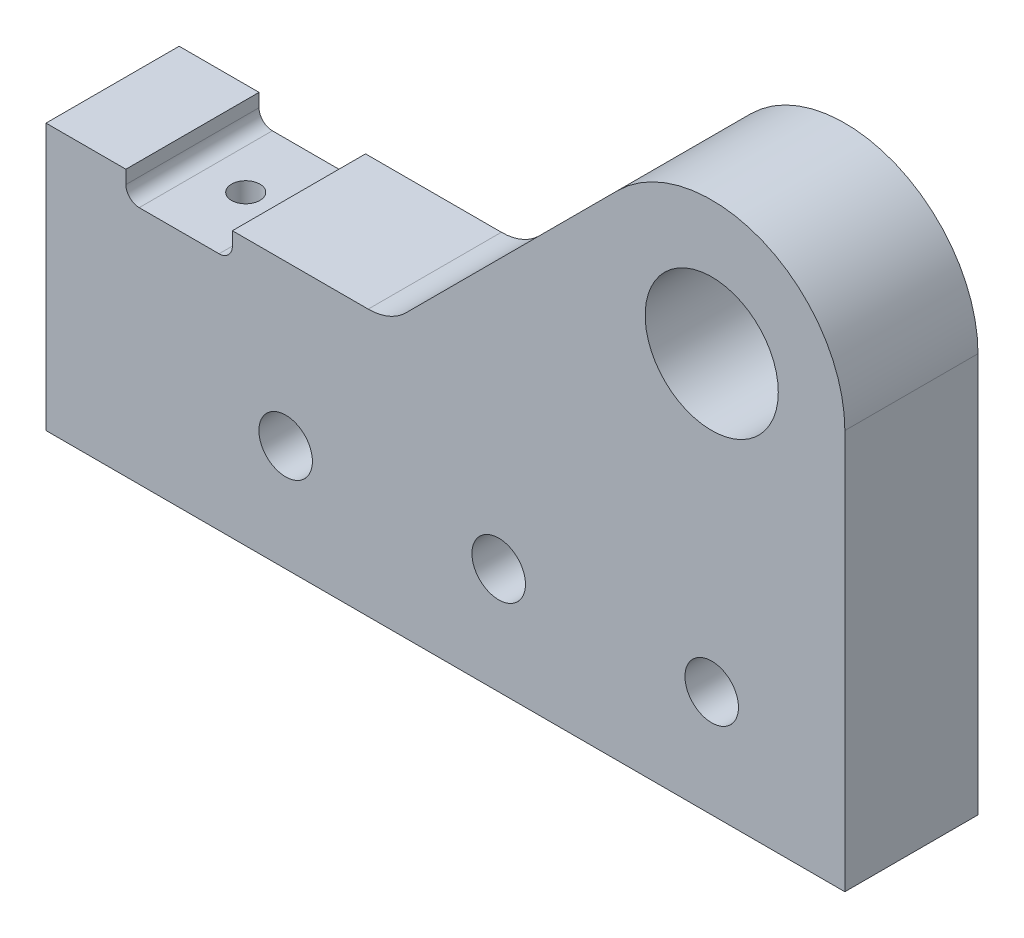
ISO-10303-21;
HEADER;
FILE_DESCRIPTION(('STEP AP214'),'2;1');
FILE_NAME('part.step','',(''),(''),'','','');
FILE_SCHEMA(('AUTOMOTIVE_DESIGN { 1 0 10303 214 1 1 1 1 }'));
ENDSEC;
DATA;
#1=APPLICATION_CONTEXT('core data for automotive mechanical design processes');
#2=APPLICATION_PROTOCOL_DEFINITION('international standard','automotive_design',2000,#1);
#3=PRODUCT_CONTEXT('',#1,'mechanical');
#4=PRODUCT('Part','Part','',(#3));
#5=PRODUCT_RELATED_PRODUCT_CATEGORY('part','',(#4));
#6=PRODUCT_DEFINITION_FORMATION('','',#4);
#7=PRODUCT_DEFINITION_CONTEXT('part definition',#1,'design');
#8=PRODUCT_DEFINITION('design','',#6,#7);
#9=PRODUCT_DEFINITION_SHAPE('','',#8);
#10=(LENGTH_UNIT() NAMED_UNIT(*) SI_UNIT(.MILLI.,.METRE.));
#11=(NAMED_UNIT(*) PLANE_ANGLE_UNIT() SI_UNIT($,.RADIAN.));
#12=(NAMED_UNIT(*) SI_UNIT($,.STERADIAN.) SOLID_ANGLE_UNIT());
#13=UNCERTAINTY_MEASURE_WITH_UNIT(LENGTH_MEASURE(1.E-05),#10,'distance_accuracy_value','');
#14=(GEOMETRIC_REPRESENTATION_CONTEXT(3) GLOBAL_UNCERTAINTY_ASSIGNED_CONTEXT((#13)) GLOBAL_UNIT_ASSIGNED_CONTEXT((#10,
#11,#12)) REPRESENTATION_CONTEXT('',''));
#15=CARTESIAN_POINT('',(0.,0.,0.));
#16=DIRECTION('',(0.,0.,1.));
#17=DIRECTION('',(1.,0.,0.));
#18=AXIS2_PLACEMENT_3D('',#15,#16,#17);
#19=CARTESIAN_POINT('',(25.4,25.4,0.));
#20=DIRECTION('',(0.,0.,-1.));
#21=DIRECTION('',(-1.,0.,0.));
#22=AXIS2_PLACEMENT_3D('',#19,#20,#21);
#23=PLANE('',#22);
#24=CARTESIAN_POINT('',(25.4,25.4,0.));
#25=DIRECTION('',(0.,0.,1.));
#26=DIRECTION('',(1.,0.,0.));
#27=AXIS2_PLACEMENT_3D('',#24,#25,#26);
#28=CIRCLE('',#27,6.35000000000002);
#29=CARTESIAN_POINT('',(31.75,25.4,0.));
#30=VERTEX_POINT('',#29);
#31=EDGE_CURVE('E363',#30,#30,#28,.T.);
#32=ORIENTED_EDGE('',*,*,#31,.T.);
#33=EDGE_LOOP('',(#32));
#34=FACE_BOUND('',#33,.T.);
#35=DIRECTION('',(0.,1.,0.));
#36=VECTOR('',#35,1.);
#37=CARTESIAN_POINT('',(38.1,12.7,0.));
#38=LINE('',#37,#36);
#39=CARTESIAN_POINT('',(38.1,-12.7,0.));
#40=VERTEX_POINT('',#39);
#41=CARTESIAN_POINT('',(38.1,25.4,0.));
#42=VERTEX_POINT('',#41);
#43=EDGE_CURVE('E121',#40,#42,#38,.T.);
#44=ORIENTED_EDGE('',*,*,#43,.F.);
#45=DIRECTION('',(1.,0.,0.));
#46=VECTOR('',#45,1.);
#47=CARTESIAN_POINT('',(-38.1,-12.7,0.));
#48=LINE('',#47,#46);
#49=CARTESIAN_POINT('',(-38.1,-12.7,0.));
#50=VERTEX_POINT('',#49);
#51=EDGE_CURVE('E222',#50,#40,#48,.T.);
#52=ORIENTED_EDGE('',*,*,#51,.F.);
#53=DIRECTION('',(0.,-1.,0.));
#54=VECTOR('',#53,1.);
#55=CARTESIAN_POINT('',(-38.1,-12.7,0.));
#56=LINE('',#55,#54);
#57=CARTESIAN_POINT('',(-38.1,12.7,0.));
#58=VERTEX_POINT('',#57);
#59=EDGE_CURVE('E114',#58,#50,#56,.T.);
#60=ORIENTED_EDGE('',*,*,#59,.F.);
#61=DIRECTION('',(-1.,0.,0.));
#62=VECTOR('',#61,1.);
#63=CARTESIAN_POINT('',(-38.1,12.7,0.));
#64=LINE('',#63,#62);
#65=CARTESIAN_POINT('',(-30.48,12.7,0.));
#66=VERTEX_POINT('',#65);
#67=EDGE_CURVE('E173',#66,#58,#64,.T.);
#68=ORIENTED_EDGE('',*,*,#67,.F.);
#69=DIRECTION('',(0.,1.,0.));
#70=VECTOR('',#69,1.);
#71=CARTESIAN_POINT('',(-30.48,12.7,0.));
#72=LINE('',#71,#70);
#73=CARTESIAN_POINT('',(-30.48,11.43,0.));
#74=VERTEX_POINT('',#73);
#75=EDGE_CURVE('E215',#74,#66,#72,.T.);
#76=ORIENTED_EDGE('',*,*,#75,.F.);
#77=CARTESIAN_POINT('',(-29.21,11.43,0.));
#78=DIRECTION('',(0.,0.,-1.));
#79=DIRECTION('',(-1.,0.,0.));
#80=AXIS2_PLACEMENT_3D('',#77,#78,#79);
#81=CIRCLE('',#80,1.27);
#82=CARTESIAN_POINT('',(-29.21,10.16,0.));
#83=VERTEX_POINT('',#82);
#84=EDGE_CURVE('E212',#83,#74,#81,.T.);
#85=ORIENTED_EDGE('',*,*,#84,.F.);
#86=DIRECTION('',(-1.,0.,0.));
#87=VECTOR('',#86,1.);
#88=CARTESIAN_POINT('',(-29.21,10.16,0.));
#89=LINE('',#88,#87);
#90=CARTESIAN_POINT('',(-21.59,10.16,0.));
#91=VERTEX_POINT('',#90);
#92=EDGE_CURVE('E209',#91,#83,#89,.T.);
#93=ORIENTED_EDGE('',*,*,#92,.F.);
#94=CARTESIAN_POINT('',(-21.59,11.43,0.));
#95=DIRECTION('',(0.,0.,-1.));
#96=DIRECTION('',(1.,0.,0.));
#97=AXIS2_PLACEMENT_3D('',#94,#95,#96);
#98=CIRCLE('',#97,1.27);
#99=CARTESIAN_POINT('',(-20.32,11.43,0.));
#100=VERTEX_POINT('',#99);
#101=EDGE_CURVE('E206',#100,#91,#98,.T.);
#102=ORIENTED_EDGE('',*,*,#101,.F.);
#103=DIRECTION('',(0.,-1.,0.));
#104=VECTOR('',#103,1.);
#105=CARTESIAN_POINT('',(-20.32,11.43,0.));
#106=LINE('',#105,#104);
#107=CARTESIAN_POINT('',(-20.32,12.7,0.));
#108=VERTEX_POINT('',#107);
#109=EDGE_CURVE('E203',#108,#100,#106,.T.);
#110=ORIENTED_EDGE('',*,*,#109,.F.);
#111=DIRECTION('',(-1.,0.,0.));
#112=VECTOR('',#111,1.);
#113=CARTESIAN_POINT('',(-20.32,12.7,0.));
#114=LINE('',#113,#112);
#115=CARTESIAN_POINT('',(-7.36471713899351,12.7,0.));
#116=VERTEX_POINT('',#115);
#117=EDGE_CURVE('E200',#116,#108,#114,.T.);
#118=ORIENTED_EDGE('',*,*,#117,.F.);
#119=CARTESIAN_POINT('',(-7.36471713899355,17.78,0.));
#120=DIRECTION('',(0.,0.,-1.));
#121=DIRECTION('',(-1.,0.,0.));
#122=AXIS2_PLACEMENT_3D('',#119,#120,#121);
#123=CIRCLE('',#122,5.08000000000001);
#124=CARTESIAN_POINT('',(-3.77261469056584,14.1878975515723,0.));
#125=VERTEX_POINT('',#124);
#126=EDGE_CURVE('E197',#125,#116,#123,.T.);
#127=ORIENTED_EDGE('',*,*,#126,.F.);
#128=DIRECTION('',(-0.707106781186545,-0.70710678118655,0.));
#129=VECTOR('',#128,1.);
#130=CARTESIAN_POINT('',(-3.77261469056584,14.1878975515723,0.));
#131=LINE('',#130,#129);
#132=CARTESIAN_POINT('',(16.4197438789308,34.3802561210691,0.));
#133=VERTEX_POINT('',#132);
#134=EDGE_CURVE('E194',#133,#125,#131,.T.);
#135=ORIENTED_EDGE('',*,*,#134,.F.);
#136=CARTESIAN_POINT('',(25.4,25.4,0.));
#137=DIRECTION('',(0.,0.,1.));
#138=DIRECTION('',(-1.,0.,0.));
#139=AXIS2_PLACEMENT_3D('',#136,#137,#138);
#140=CIRCLE('',#139,12.7);
#141=EDGE_CURVE('E190',#42,#133,#140,.T.);
#142=ORIENTED_EDGE('',*,*,#141,.F.);
#143=EDGE_LOOP('',(#44,#52,#60,#68,#76,#85,#93,#102,#110,#118,#127,#135,#142));
#144=FACE_BOUND('',#143,.T.);
#145=CARTESIAN_POINT('',(25.4,-2.54,0.));
#146=DIRECTION('',(0.,0.,1.));
#147=DIRECTION('',(1.,0.,0.));
#148=AXIS2_PLACEMENT_3D('',#145,#146,#147);
#149=CIRCLE('',#148,2.5527);
#150=CARTESIAN_POINT('',(27.9527,-2.54,0.));
#151=VERTEX_POINT('',#150);
#152=EDGE_CURVE('E369',#151,#151,#149,.T.);
#153=ORIENTED_EDGE('',*,*,#152,.T.);
#154=EDGE_LOOP('',(#153));
#155=FACE_BOUND('',#154,.T.);
#156=CARTESIAN_POINT('',(5.07999999999999,-2.54,0.));
#157=DIRECTION('',(0.,0.,1.));
#158=DIRECTION('',(1.,0.,0.));
#159=AXIS2_PLACEMENT_3D('',#156,#157,#158);
#160=CIRCLE('',#159,2.5527);
#161=CARTESIAN_POINT('',(7.63269999999999,-2.54,0.));
#162=VERTEX_POINT('',#161);
#163=EDGE_CURVE('E381',#162,#162,#160,.T.);
#164=ORIENTED_EDGE('',*,*,#163,.T.);
#165=EDGE_LOOP('',(#164));
#166=FACE_BOUND('',#165,.T.);
#167=CARTESIAN_POINT('',(-15.24,-2.54,0.));
#168=DIRECTION('',(0.,0.,1.));
#169=DIRECTION('',(1.,0.,0.));
#170=AXIS2_PLACEMENT_3D('',#167,#168,#169);
#171=CIRCLE('',#170,2.5527);
#172=CARTESIAN_POINT('',(-12.6873,-2.54,0.));
#173=VERTEX_POINT('',#172);
#174=EDGE_CURVE('E393',#173,#173,#171,.T.);
#175=ORIENTED_EDGE('',*,*,#174,.T.);
#176=EDGE_LOOP('',(#175));
#177=FACE_BOUND('',#176,.T.);
#178=ADVANCED_FACE('F51',(#34,#144,#155,#166,#177),#23,.T.);
#179=CARTESIAN_POINT('',(25.4,25.4,12.7));
#180=DIRECTION('',(0.,0.,-1.));
#181=DIRECTION('',(-1.,0.,0.));
#182=AXIS2_PLACEMENT_3D('',#179,#180,#181);
#183=PLANE('',#182);
#184=CARTESIAN_POINT('',(-15.24,-2.54,12.7));
#185=DIRECTION('',(0.,0.,1.));
#186=DIRECTION('',(1.,0.,0.));
#187=AXIS2_PLACEMENT_3D('',#184,#185,#186);
#188=CIRCLE('',#187,2.5527);
#189=CARTESIAN_POINT('',(-12.6873,-2.54,12.7));
#190=VERTEX_POINT('',#189);
#191=EDGE_CURVE('E399',#190,#190,#188,.T.);
#192=ORIENTED_EDGE('',*,*,#191,.F.);
#193=EDGE_LOOP('',(#192));
#194=FACE_BOUND('',#193,.T.);
#195=CARTESIAN_POINT('',(5.07999999999999,-2.54,12.7));
#196=DIRECTION('',(0.,0.,1.));
#197=DIRECTION('',(1.,0.,0.));
#198=AXIS2_PLACEMENT_3D('',#195,#196,#197);
#199=CIRCLE('',#198,2.5527);
#200=CARTESIAN_POINT('',(7.63269999999999,-2.54,12.7));
#201=VERTEX_POINT('',#200);
#202=EDGE_CURVE('E387',#201,#201,#199,.T.);
#203=ORIENTED_EDGE('',*,*,#202,.F.);
#204=EDGE_LOOP('',(#203));
#205=FACE_BOUND('',#204,.T.);
#206=CARTESIAN_POINT('',(25.4,-2.54,12.7));
#207=DIRECTION('',(0.,0.,1.));
#208=DIRECTION('',(1.,0.,0.));
#209=AXIS2_PLACEMENT_3D('',#206,#207,#208);
#210=CIRCLE('',#209,2.5527);
#211=CARTESIAN_POINT('',(27.9527,-2.54,12.7));
#212=VERTEX_POINT('',#211);
#213=EDGE_CURVE('E375',#212,#212,#210,.T.);
#214=ORIENTED_EDGE('',*,*,#213,.F.);
#215=EDGE_LOOP('',(#214));
#216=FACE_BOUND('',#215,.T.);
#217=DIRECTION('',(0.,1.,0.));
#218=VECTOR('',#217,1.);
#219=CARTESIAN_POINT('',(38.1,-12.7,12.7));
#220=LINE('',#219,#218);
#221=CARTESIAN_POINT('',(38.1,-12.7,12.7));
#222=VERTEX_POINT('',#221);
#223=CARTESIAN_POINT('',(38.1,25.4,12.7));
#224=VERTEX_POINT('',#223);
#225=EDGE_CURVE('E127',#222,#224,#220,.T.);
#226=ORIENTED_EDGE('',*,*,#225,.T.);
#227=CARTESIAN_POINT('',(25.4,25.4,12.7));
#228=DIRECTION('',(0.,0.,1.));
#229=DIRECTION('',(-1.,0.,0.));
#230=AXIS2_PLACEMENT_3D('',#227,#228,#229);
#231=CIRCLE('',#230,12.7);
#232=CARTESIAN_POINT('',(16.4197438789308,34.3802561210691,12.7));
#233=VERTEX_POINT('',#232);
#234=EDGE_CURVE('E324',#224,#233,#231,.T.);
#235=ORIENTED_EDGE('',*,*,#234,.T.);
#236=DIRECTION('',(-0.707106781186545,-0.70710678118655,0.));
#237=VECTOR('',#236,1.);
#238=CARTESIAN_POINT('',(-3.77261469056584,14.1878975515723,12.7));
#239=LINE('',#238,#237);
#240=CARTESIAN_POINT('',(-3.77261469056584,14.1878975515723,12.7));
#241=VERTEX_POINT('',#240);
#242=EDGE_CURVE('E269',#233,#241,#239,.T.);
#243=ORIENTED_EDGE('',*,*,#242,.T.);
#244=CARTESIAN_POINT('',(-7.36471713899355,17.78,12.7));
#245=DIRECTION('',(0.,0.,-1.));
#246=DIRECTION('',(-1.,0.,0.));
#247=AXIS2_PLACEMENT_3D('',#244,#245,#246);
#248=CIRCLE('',#247,5.08000000000001);
#249=CARTESIAN_POINT('',(-7.36471713899351,12.7,12.7));
#250=VERTEX_POINT('',#249);
#251=EDGE_CURVE('E288',#241,#250,#248,.T.);
#252=ORIENTED_EDGE('',*,*,#251,.T.);
#253=DIRECTION('',(-1.,0.,0.));
#254=VECTOR('',#253,1.);
#255=CARTESIAN_POINT('',(-20.32,12.7,12.7));
#256=LINE('',#255,#254);
#257=CARTESIAN_POINT('',(-20.32,12.7,12.7));
#258=VERTEX_POINT('',#257);
#259=EDGE_CURVE('E284',#250,#258,#256,.T.);
#260=ORIENTED_EDGE('',*,*,#259,.T.);
#261=DIRECTION('',(0.,-1.,0.));
#262=VECTOR('',#261,1.);
#263=CARTESIAN_POINT('',(-20.32,11.43,12.7));
#264=LINE('',#263,#262);
#265=CARTESIAN_POINT('',(-20.32,11.43,12.7));
#266=VERTEX_POINT('',#265);
#267=EDGE_CURVE('E287',#258,#266,#264,.T.);
#268=ORIENTED_EDGE('',*,*,#267,.T.);
#269=CARTESIAN_POINT('',(-21.59,11.43,12.7));
#270=DIRECTION('',(0.,0.,-1.));
#271=DIRECTION('',(1.,0.,0.));
#272=AXIS2_PLACEMENT_3D('',#269,#270,#271);
#273=CIRCLE('',#272,1.27);
#274=CARTESIAN_POINT('',(-21.59,10.16,12.7));
#275=VERTEX_POINT('',#274);
#276=EDGE_CURVE('E294',#266,#275,#273,.T.);
#277=ORIENTED_EDGE('',*,*,#276,.T.);
#278=DIRECTION('',(-1.,0.,0.));
#279=VECTOR('',#278,1.);
#280=CARTESIAN_POINT('',(-29.21,10.16,12.7));
#281=LINE('',#280,#279);
#282=CARTESIAN_POINT('',(-29.21,10.16,12.7));
#283=VERTEX_POINT('',#282);
#284=EDGE_CURVE('E301',#275,#283,#281,.T.);
#285=ORIENTED_EDGE('',*,*,#284,.T.);
#286=CARTESIAN_POINT('',(-29.21,11.43,12.7));
#287=DIRECTION('',(0.,0.,-1.));
#288=DIRECTION('',(-1.,0.,0.));
#289=AXIS2_PLACEMENT_3D('',#286,#287,#288);
#290=CIRCLE('',#289,1.27);
#291=CARTESIAN_POINT('',(-30.48,11.43,12.7));
#292=VERTEX_POINT('',#291);
#293=EDGE_CURVE('E304',#283,#292,#290,.T.);
#294=ORIENTED_EDGE('',*,*,#293,.T.);
#295=DIRECTION('',(0.,1.,0.));
#296=VECTOR('',#295,1.);
#297=CARTESIAN_POINT('',(-30.48,12.7,12.7));
#298=LINE('',#297,#296);
#299=CARTESIAN_POINT('',(-30.48,12.7,12.7));
#300=VERTEX_POINT('',#299);
#301=EDGE_CURVE('E164',#292,#300,#298,.T.);
#302=ORIENTED_EDGE('',*,*,#301,.T.);
#303=DIRECTION('',(-1.,0.,0.));
#304=VECTOR('',#303,1.);
#305=CARTESIAN_POINT('',(-38.1,12.7,12.7));
#306=LINE('',#305,#304);
#307=CARTESIAN_POINT('',(-38.1,12.7,12.7));
#308=VERTEX_POINT('',#307);
#309=EDGE_CURVE('E157',#300,#308,#306,.T.);
#310=ORIENTED_EDGE('',*,*,#309,.T.);
#311=DIRECTION('',(0.,-1.,0.));
#312=VECTOR('',#311,1.);
#313=CARTESIAN_POINT('',(-38.1,-12.7,12.7));
#314=LINE('',#313,#312);
#315=CARTESIAN_POINT('',(-38.1,-12.7,12.7));
#316=VERTEX_POINT('',#315);
#317=EDGE_CURVE('E162',#308,#316,#314,.T.);
#318=ORIENTED_EDGE('',*,*,#317,.T.);
#319=DIRECTION('',(1.,0.,0.));
#320=VECTOR('',#319,1.);
#321=CARTESIAN_POINT('',(-38.1,-12.7,12.7));
#322=LINE('',#321,#320);
#323=EDGE_CURVE('E69',#316,#222,#322,.T.);
#324=ORIENTED_EDGE('',*,*,#323,.T.);
#325=EDGE_LOOP('',(#226,#235,#243,#252,#260,#268,#277,#285,#294,#302,#310,#318,#324));
#326=FACE_BOUND('',#325,.T.);
#327=CARTESIAN_POINT('',(25.4,25.4,12.7));
#328=DIRECTION('',(0.,0.,1.));
#329=DIRECTION('',(1.,0.,0.));
#330=AXIS2_PLACEMENT_3D('',#327,#328,#329);
#331=CIRCLE('',#330,6.35000000000002);
#332=CARTESIAN_POINT('',(31.75,25.4,12.7));
#333=VERTEX_POINT('',#332);
#334=EDGE_CURVE('E191',#333,#333,#331,.T.);
#335=ORIENTED_EDGE('',*,*,#334,.F.);
#336=EDGE_LOOP('',(#335));
#337=FACE_BOUND('',#336,.T.);
#338=ADVANCED_FACE('F159',(#194,#205,#216,#326,#337),#183,.F.);
#339=CARTESIAN_POINT('',(38.1,12.7,12.7));
#340=DIRECTION('',(-1.,0.,0.));
#341=DIRECTION('',(0.,0.,1.));
#342=AXIS2_PLACEMENT_3D('',#339,#340,#341);
#343=PLANE('',#342);
#344=ORIENTED_EDGE('',*,*,#43,.T.);
#345=DIRECTION('',(0.,0.,-1.));
#346=VECTOR('',#345,1.);
#347=CARTESIAN_POINT('',(38.1,25.4,12.7));
#348=LINE('',#347,#346);
#349=EDGE_CURVE('E11',#224,#42,#348,.T.);
#350=ORIENTED_EDGE('',*,*,#349,.F.);
#351=ORIENTED_EDGE('',*,*,#225,.F.);
#352=DIRECTION('',(0.,0.,-1.));
#353=VECTOR('',#352,1.);
#354=CARTESIAN_POINT('',(38.1,-12.7,12.7));
#355=LINE('',#354,#353);
#356=EDGE_CURVE('E184',#222,#40,#355,.T.);
#357=ORIENTED_EDGE('',*,*,#356,.T.);
#358=EDGE_LOOP('',(#344,#350,#351,#357));
#359=FACE_BOUND('',#358,.T.);
#360=ADVANCED_FACE('F53',(#359),#343,.F.);
#361=CARTESIAN_POINT('',(25.4,25.4,12.7));
#362=DIRECTION('',(0.,0.,-1.));
#363=DIRECTION('',(-1.,0.,0.));
#364=AXIS2_PLACEMENT_3D('',#361,#362,#363);
#365=CYLINDRICAL_SURFACE('',#364,12.7);
#366=ORIENTED_EDGE('',*,*,#141,.T.);
#367=DIRECTION('',(0.,0.,-1.));
#368=VECTOR('',#367,1.);
#369=CARTESIAN_POINT('',(16.4197438789308,34.3802561210691,12.7));
#370=LINE('',#369,#368);
#371=EDGE_CURVE('E61',#233,#133,#370,.T.);
#372=ORIENTED_EDGE('',*,*,#371,.F.);
#373=ORIENTED_EDGE('',*,*,#234,.F.);
#374=ORIENTED_EDGE('',*,*,#349,.T.);
#375=EDGE_LOOP('',(#366,#372,#373,#374));
#376=FACE_BOUND('',#375,.T.);
#377=ADVANCED_FACE('F579',(#376),#365,.T.);
#378=CARTESIAN_POINT('',(-3.77261469056584,14.1878975515723,12.7));
#379=DIRECTION('',(0.70710678118655,-0.707106781186545,0.));
#380=DIRECTION('',(0.707106781186545,0.70710678118655,0.));
#381=AXIS2_PLACEMENT_3D('',#378,#379,#380);
#382=PLANE('',#381);
#383=ORIENTED_EDGE('',*,*,#134,.T.);
#384=DIRECTION('',(0.,0.,-1.));
#385=VECTOR('',#384,1.);
#386=CARTESIAN_POINT('',(-3.77261469056584,14.1878975515723,12.7));
#387=LINE('',#386,#385);
#388=EDGE_CURVE('E256',#241,#125,#387,.T.);
#389=ORIENTED_EDGE('',*,*,#388,.F.);
#390=ORIENTED_EDGE('',*,*,#242,.F.);
#391=ORIENTED_EDGE('',*,*,#371,.T.);
#392=EDGE_LOOP('',(#383,#389,#390,#391));
#393=FACE_BOUND('',#392,.T.);
#394=ADVANCED_FACE('F267',(#393),#382,.F.);
#395=CARTESIAN_POINT('',(-7.36471713899355,17.78,12.7));
#396=DIRECTION('',(0.,0.,-1.));
#397=DIRECTION('',(-1.,0.,0.));
#398=AXIS2_PLACEMENT_3D('',#395,#396,#397);
#399=CYLINDRICAL_SURFACE('',#398,5.08000000000001);
#400=ORIENTED_EDGE('',*,*,#126,.T.);
#401=DIRECTION('',(0.,0.,-1.));
#402=VECTOR('',#401,1.);
#403=CARTESIAN_POINT('',(-7.36471713899351,12.7,12.7));
#404=LINE('',#403,#402);
#405=EDGE_CURVE('E252',#250,#116,#404,.T.);
#406=ORIENTED_EDGE('',*,*,#405,.F.);
#407=ORIENTED_EDGE('',*,*,#251,.F.);
#408=ORIENTED_EDGE('',*,*,#388,.T.);
#409=EDGE_LOOP('',(#400,#406,#407,#408));
#410=FACE_BOUND('',#409,.T.);
#411=ADVANCED_FACE('F278',(#410),#399,.F.);
#412=CARTESIAN_POINT('',(-20.32,12.7,12.7));
#413=DIRECTION('',(0.,-1.,0.));
#414=DIRECTION('',(0.,0.,-1.));
#415=AXIS2_PLACEMENT_3D('',#412,#413,#414);
#416=PLANE('',#415);
#417=ORIENTED_EDGE('',*,*,#117,.T.);
#418=DIRECTION('',(0.,0.,-1.));
#419=VECTOR('',#418,1.);
#420=CARTESIAN_POINT('',(-20.32,12.7,12.7));
#421=LINE('',#420,#419);
#422=EDGE_CURVE('E248',#258,#108,#421,.T.);
#423=ORIENTED_EDGE('',*,*,#422,.F.);
#424=ORIENTED_EDGE('',*,*,#259,.F.);
#425=ORIENTED_EDGE('',*,*,#405,.T.);
#426=EDGE_LOOP('',(#417,#423,#424,#425));
#427=FACE_BOUND('',#426,.T.);
#428=ADVANCED_FACE('F282',(#427),#416,.F.);
#429=CARTESIAN_POINT('',(-20.32,11.43,12.7));
#430=DIRECTION('',(1.,0.,0.));
#431=DIRECTION('',(0.,0.,-1.));
#432=AXIS2_PLACEMENT_3D('',#429,#430,#431);
#433=PLANE('',#432);
#434=ORIENTED_EDGE('',*,*,#109,.T.);
#435=DIRECTION('',(0.,0.,-1.));
#436=VECTOR('',#435,1.);
#437=CARTESIAN_POINT('',(-20.32,11.43,12.7));
#438=LINE('',#437,#436);
#439=EDGE_CURVE('E244',#266,#100,#438,.T.);
#440=ORIENTED_EDGE('',*,*,#439,.F.);
#441=ORIENTED_EDGE('',*,*,#267,.F.);
#442=ORIENTED_EDGE('',*,*,#422,.T.);
#443=EDGE_LOOP('',(#434,#440,#441,#442));
#444=FACE_BOUND('',#443,.T.);
#445=ADVANCED_FACE('F614',(#444),#433,.F.);
#446=CARTESIAN_POINT('',(-21.59,11.43,12.7));
#447=DIRECTION('',(0.,0.,-1.));
#448=DIRECTION('',(-1.,0.,0.));
#449=AXIS2_PLACEMENT_3D('',#446,#447,#448);
#450=CYLINDRICAL_SURFACE('',#449,1.27);
#451=ORIENTED_EDGE('',*,*,#101,.T.);
#452=DIRECTION('',(0.,0.,-1.));
#453=VECTOR('',#452,1.);
#454=CARTESIAN_POINT('',(-21.59,10.16,12.7));
#455=LINE('',#454,#453);
#456=EDGE_CURVE('E240',#275,#91,#455,.T.);
#457=ORIENTED_EDGE('',*,*,#456,.F.);
#458=ORIENTED_EDGE('',*,*,#276,.F.);
#459=ORIENTED_EDGE('',*,*,#439,.T.);
#460=EDGE_LOOP('',(#451,#457,#458,#459));
#461=FACE_BOUND('',#460,.T.);
#462=ADVANCED_FACE('F426',(#461),#450,.F.);
#463=CARTESIAN_POINT('',(-29.21,10.16,12.7));
#464=DIRECTION('',(0.,-1.,0.));
#465=DIRECTION('',(0.,0.,-1.));
#466=AXIS2_PLACEMENT_3D('',#463,#464,#465);
#467=PLANE('',#466);
#468=CARTESIAN_POINT('',(-25.4,10.16,6.35));
#469=DIRECTION('',(0.,1.,0.));
#470=DIRECTION('',(0.,0.,1.));
#471=AXIS2_PLACEMENT_3D('',#468,#469,#470);
#472=CIRCLE('',#471,1.35254999999999);
#473=CARTESIAN_POINT('',(-25.4,10.16,7.70254999999999));
#474=VERTEX_POINT('',#473);
#475=EDGE_CURVE('E411',#474,#474,#472,.T.);
#476=ORIENTED_EDGE('',*,*,#475,.F.);
#477=EDGE_LOOP('',(#476));
#478=FACE_BOUND('',#477,.T.);
#479=ORIENTED_EDGE('',*,*,#92,.T.);
#480=DIRECTION('',(0.,0.,-1.));
#481=VECTOR('',#480,1.);
#482=CARTESIAN_POINT('',(-29.21,10.16,12.7));
#483=LINE('',#482,#481);
#484=EDGE_CURVE('E236',#283,#83,#483,.T.);
#485=ORIENTED_EDGE('',*,*,#484,.F.);
#486=ORIENTED_EDGE('',*,*,#284,.F.);
#487=ORIENTED_EDGE('',*,*,#456,.T.);
#488=EDGE_LOOP('',(#479,#485,#486,#487));
#489=FACE_BOUND('',#488,.T.);
#490=ADVANCED_FACE('F422',(#478,#489),#467,.F.);
#491=CARTESIAN_POINT('',(-29.21,11.43,12.7));
#492=DIRECTION('',(0.,0.,-1.));
#493=DIRECTION('',(-1.,0.,0.));
#494=AXIS2_PLACEMENT_3D('',#491,#492,#493);
#495=CYLINDRICAL_SURFACE('',#494,1.27);
#496=ORIENTED_EDGE('',*,*,#84,.T.);
#497=DIRECTION('',(0.,0.,-1.));
#498=VECTOR('',#497,1.);
#499=CARTESIAN_POINT('',(-30.48,11.43,12.7));
#500=LINE('',#499,#498);
#501=EDGE_CURVE('E232',#292,#74,#500,.T.);
#502=ORIENTED_EDGE('',*,*,#501,.F.);
#503=ORIENTED_EDGE('',*,*,#293,.F.);
#504=ORIENTED_EDGE('',*,*,#484,.T.);
#505=EDGE_LOOP('',(#496,#502,#503,#504));
#506=FACE_BOUND('',#505,.T.);
#507=ADVANCED_FACE('F425',(#506),#495,.F.);
#508=CARTESIAN_POINT('',(-30.48,12.7,12.7));
#509=DIRECTION('',(-1.,0.,0.));
#510=DIRECTION('',(0.,0.,1.));
#511=AXIS2_PLACEMENT_3D('',#508,#509,#510);
#512=PLANE('',#511);
#513=ORIENTED_EDGE('',*,*,#75,.T.);
#514=DIRECTION('',(0.,0.,-1.));
#515=VECTOR('',#514,1.);
#516=CARTESIAN_POINT('',(-30.48,12.7,12.7));
#517=LINE('',#516,#515);
#518=EDGE_CURVE('E175',#300,#66,#517,.T.);
#519=ORIENTED_EDGE('',*,*,#518,.F.);
#520=ORIENTED_EDGE('',*,*,#301,.F.);
#521=ORIENTED_EDGE('',*,*,#501,.T.);
#522=EDGE_LOOP('',(#513,#519,#520,#521));
#523=FACE_BOUND('',#522,.T.);
#524=ADVANCED_FACE('F439',(#523),#512,.F.);
#525=CARTESIAN_POINT('',(-38.1,12.7,12.7));
#526=DIRECTION('',(0.,-1.,0.));
#527=DIRECTION('',(0.,0.,-1.));
#528=AXIS2_PLACEMENT_3D('',#525,#526,#527);
#529=PLANE('',#528);
#530=ORIENTED_EDGE('',*,*,#67,.T.);
#531=DIRECTION('',(0.,0.,-1.));
#532=VECTOR('',#531,1.);
#533=CARTESIAN_POINT('',(-38.1,12.7,12.7));
#534=LINE('',#533,#532);
#535=EDGE_CURVE('E170',#308,#58,#534,.T.);
#536=ORIENTED_EDGE('',*,*,#535,.F.);
#537=ORIENTED_EDGE('',*,*,#309,.F.);
#538=ORIENTED_EDGE('',*,*,#518,.T.);
#539=EDGE_LOOP('',(#530,#536,#537,#538));
#540=FACE_BOUND('',#539,.T.);
#541=ADVANCED_FACE('F171',(#540),#529,.F.);
#542=CARTESIAN_POINT('',(-38.1,-12.7,12.7));
#543=DIRECTION('',(1.,0.,0.));
#544=DIRECTION('',(0.,0.,-1.));
#545=AXIS2_PLACEMENT_3D('',#542,#543,#544);
#546=PLANE('',#545);
#547=ORIENTED_EDGE('',*,*,#59,.T.);
#548=DIRECTION('',(0.,0.,-1.));
#549=VECTOR('',#548,1.);
#550=CARTESIAN_POINT('',(-38.1,-12.7,12.7));
#551=LINE('',#550,#549);
#552=EDGE_CURVE('E176',#316,#50,#551,.T.);
#553=ORIENTED_EDGE('',*,*,#552,.F.);
#554=ORIENTED_EDGE('',*,*,#317,.F.);
#555=ORIENTED_EDGE('',*,*,#535,.T.);
#556=EDGE_LOOP('',(#547,#553,#554,#555));
#557=FACE_BOUND('',#556,.T.);
#558=ADVANCED_FACE('F178',(#557),#546,.F.);
#559=CARTESIAN_POINT('',(-38.1,-12.7,12.7));
#560=DIRECTION('',(0.,1.,0.));
#561=DIRECTION('',(0.,0.,1.));
#562=AXIS2_PLACEMENT_3D('',#559,#560,#561);
#563=PLANE('',#562);
#564=ORIENTED_EDGE('',*,*,#51,.T.);
#565=ORIENTED_EDGE('',*,*,#356,.F.);
#566=ORIENTED_EDGE('',*,*,#323,.F.);
#567=ORIENTED_EDGE('',*,*,#552,.T.);
#568=EDGE_LOOP('',(#564,#565,#566,#567));
#569=FACE_BOUND('',#568,.T.);
#570=ADVANCED_FACE('F460',(#569),#563,.F.);
#571=CARTESIAN_POINT('',(25.4,25.4,12.7));
#572=DIRECTION('',(0.,0.,-1.));
#573=DIRECTION('',(-1.,0.,0.));
#574=AXIS2_PLACEMENT_3D('',#571,#572,#573);
#575=CYLINDRICAL_SURFACE('',#574,6.35000000000002);
#576=ORIENTED_EDGE('',*,*,#334,.T.);
#577=EDGE_LOOP('',(#576));
#578=FACE_BOUND('',#577,.T.);
#579=ORIENTED_EDGE('',*,*,#31,.F.);
#580=EDGE_LOOP('',(#579));
#581=FACE_BOUND('',#580,.T.);
#582=ADVANCED_FACE('F463',(#578,#581),#575,.F.);
#583=CARTESIAN_POINT('',(25.4,-2.54,12.7));
#584=DIRECTION('',(0.,0.,1.));
#585=DIRECTION('',(1.,0.,0.));
#586=AXIS2_PLACEMENT_3D('',#583,#584,#585);
#587=CYLINDRICAL_SURFACE('',#586,2.5527);
#588=ORIENTED_EDGE('',*,*,#152,.F.);
#589=EDGE_LOOP('',(#588));
#590=FACE_BOUND('',#589,.T.);
#591=ORIENTED_EDGE('',*,*,#213,.T.);
#592=EDGE_LOOP('',(#591));
#593=FACE_BOUND('',#592,.T.);
#594=ADVANCED_FACE('F480',(#590,#593),#587,.F.);
#595=CARTESIAN_POINT('',(5.07999999999999,-2.54,12.7));
#596=DIRECTION('',(0.,0.,1.));
#597=DIRECTION('',(1.,0.,0.));
#598=AXIS2_PLACEMENT_3D('',#595,#596,#597);
#599=CYLINDRICAL_SURFACE('',#598,2.5527);
#600=ORIENTED_EDGE('',*,*,#163,.F.);
#601=EDGE_LOOP('',(#600));
#602=FACE_BOUND('',#601,.T.);
#603=ORIENTED_EDGE('',*,*,#202,.T.);
#604=EDGE_LOOP('',(#603));
#605=FACE_BOUND('',#604,.T.);
#606=ADVANCED_FACE('F497',(#602,#605),#599,.F.);
#607=CARTESIAN_POINT('',(-15.24,-2.54,12.7));
#608=DIRECTION('',(0.,0.,1.));
#609=DIRECTION('',(1.,0.,0.));
#610=AXIS2_PLACEMENT_3D('',#607,#608,#609);
#611=CYLINDRICAL_SURFACE('',#610,2.5527);
#612=ORIENTED_EDGE('',*,*,#174,.F.);
#613=EDGE_LOOP('',(#612));
#614=FACE_BOUND('',#613,.T.);
#615=ORIENTED_EDGE('',*,*,#191,.T.);
#616=EDGE_LOOP('',(#615));
#617=FACE_BOUND('',#616,.T.);
#618=ADVANCED_FACE('F509',(#614,#617),#611,.F.);
#619=CARTESIAN_POINT('',(-25.4,0.762000000000001,6.35));
#620=DIRECTION('',(0.,1.,0.));
#621=DIRECTION('',(0.,0.,1.));
#622=AXIS2_PLACEMENT_3D('',#619,#620,#621);
#623=CONICAL_SURFACE('',#622,1.35255,1.02974425867665);
#624=CARTESIAN_POINT('',(-25.4,-0.0506940302657261,6.35));
#625=VERTEX_POINT('',#624);
#626=VERTEX_LOOP('',#625);
#627=FACE_BOUND('',#626,.T.);
#628=CARTESIAN_POINT('',(-25.4,0.762000000000001,6.35));
#629=DIRECTION('',(0.,1.,0.));
#630=DIRECTION('',(0.,0.,1.));
#631=AXIS2_PLACEMENT_3D('',#628,#629,#630);
#632=CIRCLE('',#631,1.35255);
#633=CARTESIAN_POINT('',(-25.4,0.762000000000001,7.70255));
#634=VERTEX_POINT('',#633);
#635=EDGE_CURVE('E405',#634,#634,#632,.T.);
#636=ORIENTED_EDGE('',*,*,#635,.T.);
#637=EDGE_LOOP('',(#636));
#638=FACE_BOUND('',#637,.T.);
#639=ADVANCED_FACE('F521',(#627,#638),#623,.F.);
#640=CARTESIAN_POINT('',(-25.4,10.16,6.35));
#641=DIRECTION('',(0.,1.,0.));
#642=DIRECTION('',(0.,0.,1.));
#643=AXIS2_PLACEMENT_3D('',#640,#641,#642);
#644=CYLINDRICAL_SURFACE('',#643,1.35254999999999);
#645=ORIENTED_EDGE('',*,*,#635,.F.);
#646=EDGE_LOOP('',(#645));
#647=FACE_BOUND('',#646,.T.);
#648=ORIENTED_EDGE('',*,*,#475,.T.);
#649=EDGE_LOOP('',(#648));
#650=FACE_BOUND('',#649,.T.);
#651=ADVANCED_FACE('F420',(#647,#650),#644,.F.);
#652=CLOSED_SHELL('',(#178,#338,#360,#377,#394,#411,#428,#445,#462,#490,#507,#524,#541,#558,
#570,#582,#594,#606,#618,#639,#651));
#653=MANIFOLD_SOLID_BREP('B2',#652);
#654=ADVANCED_BREP_SHAPE_REPRESENTATION('',(#18,#653),#14);
#655=SHAPE_DEFINITION_REPRESENTATION(#9,#654);
ENDSEC;
END-ISO-10303-21;
